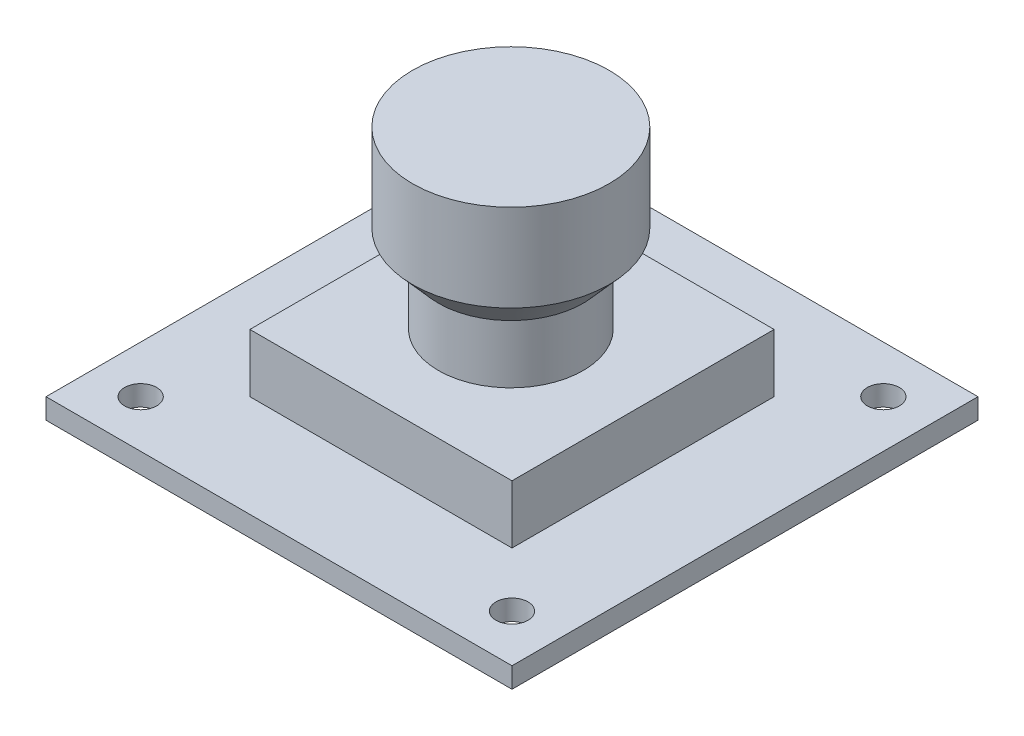
ISO-10303-21;
HEADER;
FILE_DESCRIPTION(('STEP AP214'),'2;1');
FILE_NAME('part.step','',(''),(''),'','','');
FILE_SCHEMA(('AUTOMOTIVE_DESIGN { 1 0 10303 214 1 1 1 1 }'));
ENDSEC;
DATA;
#1=APPLICATION_CONTEXT('core data for automotive mechanical design processes');
#2=APPLICATION_PROTOCOL_DEFINITION('international standard','automotive_design',2000,#1);
#3=PRODUCT_CONTEXT('',#1,'mechanical');
#4=PRODUCT('Part','Part','',(#3));
#5=PRODUCT_RELATED_PRODUCT_CATEGORY('part','',(#4));
#6=PRODUCT_DEFINITION_FORMATION('','',#4);
#7=PRODUCT_DEFINITION_CONTEXT('part definition',#1,'design');
#8=PRODUCT_DEFINITION('design','',#6,#7);
#9=PRODUCT_DEFINITION_SHAPE('','',#8);
#10=(LENGTH_UNIT() NAMED_UNIT(*) SI_UNIT(.MILLI.,.METRE.));
#11=(NAMED_UNIT(*) PLANE_ANGLE_UNIT() SI_UNIT($,.RADIAN.));
#12=(NAMED_UNIT(*) SI_UNIT($,.STERADIAN.) SOLID_ANGLE_UNIT());
#13=UNCERTAINTY_MEASURE_WITH_UNIT(LENGTH_MEASURE(1.E-05),#10,'distance_accuracy_value','');
#14=(GEOMETRIC_REPRESENTATION_CONTEXT(3) GLOBAL_UNCERTAINTY_ASSIGNED_CONTEXT((#13)) GLOBAL_UNIT_ASSIGNED_CONTEXT((#10,
#11,#12)) REPRESENTATION_CONTEXT('',''));
#15=CARTESIAN_POINT('',(0.,0.,0.));
#16=DIRECTION('',(0.,0.,1.));
#17=DIRECTION('',(1.,0.,0.));
#18=AXIS2_PLACEMENT_3D('',#15,#16,#17);
#19=CARTESIAN_POINT('',(0.,1.4,0.));
#20=DIRECTION('',(0.,-1.,0.));
#21=DIRECTION('',(0.,0.,-1.));
#22=AXIS2_PLACEMENT_3D('',#19,#20,#21);
#23=PLANE('',#22);
#24=CARTESIAN_POINT('',(3.25,1.4,-3.25));
#25=DIRECTION('',(0.,1.,0.));
#26=DIRECTION('',(0.,0.,-1.));
#27=AXIS2_PLACEMENT_3D('',#24,#25,#26);
#28=CIRCLE('',#27,1.1);
#29=CARTESIAN_POINT('',(3.25,1.4,-4.35));
#30=VERTEX_POINT('',#29);
#31=EDGE_CURVE('E199',#30,#30,#28,.T.);
#32=ORIENTED_EDGE('',*,*,#31,.F.);
#33=EDGE_LOOP('',(#32));
#34=FACE_BOUND('',#33,.T.);
#35=CARTESIAN_POINT('',(28.75,1.4,-3.25));
#36=DIRECTION('',(0.,1.,0.));
#37=DIRECTION('',(0.,0.,1.));
#38=AXIS2_PLACEMENT_3D('',#35,#36,#37);
#39=CIRCLE('',#38,1.1);
#40=CARTESIAN_POINT('',(28.75,1.4,-2.15));
#41=VERTEX_POINT('',#40);
#42=EDGE_CURVE('E205',#41,#41,#39,.T.);
#43=ORIENTED_EDGE('',*,*,#42,.F.);
#44=EDGE_LOOP('',(#43));
#45=FACE_BOUND('',#44,.T.);
#46=CARTESIAN_POINT('',(28.75,1.4,-28.75));
#47=DIRECTION('',(0.,1.,0.));
#48=DIRECTION('',(0.,0.,-1.));
#49=AXIS2_PLACEMENT_3D('',#46,#47,#48);
#50=CIRCLE('',#49,1.1);
#51=CARTESIAN_POINT('',(28.75,1.4,-29.85));
#52=VERTEX_POINT('',#51);
#53=EDGE_CURVE('E211',#52,#52,#50,.T.);
#54=ORIENTED_EDGE('',*,*,#53,.F.);
#55=EDGE_LOOP('',(#54));
#56=FACE_BOUND('',#55,.T.);
#57=CARTESIAN_POINT('',(3.25,1.4,-28.75));
#58=DIRECTION('',(0.,1.,0.));
#59=DIRECTION('',(0.,0.,1.));
#60=AXIS2_PLACEMENT_3D('',#57,#58,#59);
#61=CIRCLE('',#60,1.1);
#62=CARTESIAN_POINT('',(3.25,1.4,-27.65));
#63=VERTEX_POINT('',#62);
#64=EDGE_CURVE('E217',#63,#63,#61,.T.);
#65=ORIENTED_EDGE('',*,*,#64,.F.);
#66=EDGE_LOOP('',(#65));
#67=FACE_BOUND('',#66,.T.);
#68=DIRECTION('',(0.,0.,1.));
#69=VECTOR('',#68,1.);
#70=CARTESIAN_POINT('',(0.,1.4,0.));
#71=LINE('',#70,#69);
#72=CARTESIAN_POINT('',(0.,1.4,-32.));
#73=VERTEX_POINT('',#72);
#74=CARTESIAN_POINT('',(0.,1.4,0.));
#75=VERTEX_POINT('',#74);
#76=EDGE_CURVE('E223',#73,#75,#71,.T.);
#77=ORIENTED_EDGE('',*,*,#76,.T.);
#78=DIRECTION('',(1.,0.,0.));
#79=VECTOR('',#78,1.);
#80=CARTESIAN_POINT('',(0.,1.4,0.));
#81=LINE('',#80,#79);
#82=CARTESIAN_POINT('',(32.,1.4,0.));
#83=VERTEX_POINT('',#82);
#84=EDGE_CURVE('E226',#75,#83,#81,.T.);
#85=ORIENTED_EDGE('',*,*,#84,.T.);
#86=DIRECTION('',(0.,0.,-1.));
#87=VECTOR('',#86,1.);
#88=CARTESIAN_POINT('',(32.,1.4,0.));
#89=LINE('',#88,#87);
#90=CARTESIAN_POINT('',(32.,1.4,-32.));
#91=VERTEX_POINT('',#90);
#92=EDGE_CURVE('E229',#83,#91,#89,.T.);
#93=ORIENTED_EDGE('',*,*,#92,.T.);
#94=DIRECTION('',(-1.,0.,0.));
#95=VECTOR('',#94,1.);
#96=CARTESIAN_POINT('',(0.,1.4,-32.));
#97=LINE('',#96,#95);
#98=EDGE_CURVE('E231',#91,#73,#97,.T.);
#99=ORIENTED_EDGE('',*,*,#98,.T.);
#100=EDGE_LOOP('',(#77,#85,#93,#99));
#101=FACE_BOUND('',#100,.T.);
#102=DIRECTION('',(0.,0.,-1.));
#103=VECTOR('',#102,1.);
#104=CARTESIAN_POINT('',(25.,1.4,-7.));
#105=LINE('',#104,#103);
#106=CARTESIAN_POINT('',(25.,1.4,-7.));
#107=VERTEX_POINT('',#106);
#108=CARTESIAN_POINT('',(25.,1.4,-25.));
#109=VERTEX_POINT('',#108);
#110=EDGE_CURVE('E165',#107,#109,#105,.T.);
#111=ORIENTED_EDGE('',*,*,#110,.F.);
#112=DIRECTION('',(1.,0.,0.));
#113=VECTOR('',#112,1.);
#114=CARTESIAN_POINT('',(7.,1.4,-7.));
#115=LINE('',#114,#113);
#116=CARTESIAN_POINT('',(7.,1.4,-7.));
#117=VERTEX_POINT('',#116);
#118=EDGE_CURVE('E170',#117,#107,#115,.T.);
#119=ORIENTED_EDGE('',*,*,#118,.F.);
#120=DIRECTION('',(0.,0.,1.));
#121=VECTOR('',#120,1.);
#122=CARTESIAN_POINT('',(7.,1.4,-7.));
#123=LINE('',#122,#121);
#124=CARTESIAN_POINT('',(7.,1.4,-25.));
#125=VERTEX_POINT('',#124);
#126=EDGE_CURVE('E182',#125,#117,#123,.T.);
#127=ORIENTED_EDGE('',*,*,#126,.F.);
#128=DIRECTION('',(-1.,0.,0.));
#129=VECTOR('',#128,1.);
#130=CARTESIAN_POINT('',(7.,1.4,-25.));
#131=LINE('',#130,#129);
#132=EDGE_CURVE('E179',#109,#125,#131,.T.);
#133=ORIENTED_EDGE('',*,*,#132,.F.);
#134=EDGE_LOOP('',(#111,#119,#127,#133));
#135=FACE_BOUND('',#134,.T.);
#136=ADVANCED_FACE('F35',(#34,#45,#56,#67,#101,#135),#23,.F.);
#137=CARTESIAN_POINT('',(0.,0.,0.));
#138=DIRECTION('',(0.,-1.,0.));
#139=DIRECTION('',(0.,0.,-1.));
#140=AXIS2_PLACEMENT_3D('',#137,#138,#139);
#141=PLANE('',#140);
#142=DIRECTION('',(0.,0.,-1.));
#143=VECTOR('',#142,1.);
#144=CARTESIAN_POINT('',(0.249894634770157,0.,-27.65));
#145=LINE('',#144,#143);
#146=CARTESIAN_POINT('',(0.249894634770157,0.,-18.65));
#147=VERTEX_POINT('',#146);
#148=CARTESIAN_POINT('',(0.249894634770157,0.,-27.65));
#149=VERTEX_POINT('',#148);
#150=EDGE_CURVE('E50',#147,#149,#145,.T.);
#151=ORIENTED_EDGE('',*,*,#150,.F.);
#152=DIRECTION('',(-1.,0.,0.));
#153=VECTOR('',#152,1.);
#154=CARTESIAN_POINT('',(0.249894634770157,0.,-18.65));
#155=LINE('',#154,#153);
#156=CARTESIAN_POINT('',(4.24989463477016,0.,-18.65));
#157=VERTEX_POINT('',#156);
#158=EDGE_CURVE('E54',#157,#147,#155,.T.);
#159=ORIENTED_EDGE('',*,*,#158,.F.);
#160=DIRECTION('',(0.,0.,1.));
#161=VECTOR('',#160,1.);
#162=CARTESIAN_POINT('',(4.24989463477016,0.,-27.65));
#163=LINE('',#162,#161);
#164=CARTESIAN_POINT('',(4.24989463477016,0.,-27.65));
#165=VERTEX_POINT('',#164);
#166=EDGE_CURVE('E380',#165,#157,#163,.T.);
#167=ORIENTED_EDGE('',*,*,#166,.F.);
#168=DIRECTION('',(1.,0.,0.));
#169=VECTOR('',#168,1.);
#170=CARTESIAN_POINT('',(0.249894634770157,0.,-27.65));
#171=LINE('',#170,#169);
#172=CARTESIAN_POINT('',(3.25,0.,-27.65));
#173=VERTEX_POINT('',#172);
#174=EDGE_CURVE('E252',#173,#165,#171,.T.);
#175=ORIENTED_EDGE('',*,*,#174,.F.);
#176=CARTESIAN_POINT('',(3.25,0.,-28.75));
#177=DIRECTION('',(0.,1.,0.));
#178=DIRECTION('',(0.,0.,1.));
#179=AXIS2_PLACEMENT_3D('',#176,#177,#178);
#180=CIRCLE('',#179,1.1);
#181=EDGE_CURVE('E214',#173,#173,#180,.T.);
#182=ORIENTED_EDGE('',*,*,#181,.T.);
#183=EDGE_CURVE('E379',#149,#173,#171,.T.);
#184=ORIENTED_EDGE('',*,*,#183,.F.);
#185=EDGE_LOOP('',(#151,#159,#167,#175,#182,#184));
#186=FACE_BOUND('',#185,.T.);
#187=CARTESIAN_POINT('',(28.75,0.,-3.25));
#188=DIRECTION('',(0.,1.,0.));
#189=DIRECTION('',(0.,0.,1.));
#190=AXIS2_PLACEMENT_3D('',#187,#188,#189);
#191=CIRCLE('',#190,1.1);
#192=CARTESIAN_POINT('',(28.75,0.,-2.15));
#193=VERTEX_POINT('',#192);
#194=EDGE_CURVE('E202',#193,#193,#191,.T.);
#195=ORIENTED_EDGE('',*,*,#194,.T.);
#196=EDGE_LOOP('',(#195));
#197=FACE_BOUND('',#196,.T.);
#198=DIRECTION('',(0.,0.,1.));
#199=VECTOR('',#198,1.);
#200=CARTESIAN_POINT('',(0.,0.,0.));
#201=LINE('',#200,#199);
#202=CARTESIAN_POINT('',(0.,0.,-32.));
#203=VERTEX_POINT('',#202);
#204=CARTESIAN_POINT('',(0.,0.,0.));
#205=VERTEX_POINT('',#204);
#206=EDGE_CURVE('E220',#203,#205,#201,.T.);
#207=ORIENTED_EDGE('',*,*,#206,.F.);
#208=DIRECTION('',(-1.,0.,0.));
#209=VECTOR('',#208,1.);
#210=CARTESIAN_POINT('',(0.,0.,-32.));
#211=LINE('',#210,#209);
#212=CARTESIAN_POINT('',(32.,0.,-32.));
#213=VERTEX_POINT('',#212);
#214=EDGE_CURVE('E227',#213,#203,#211,.T.);
#215=ORIENTED_EDGE('',*,*,#214,.F.);
#216=DIRECTION('',(0.,0.,-1.));
#217=VECTOR('',#216,1.);
#218=CARTESIAN_POINT('',(32.,0.,0.));
#219=LINE('',#218,#217);
#220=CARTESIAN_POINT('',(32.,0.,0.));
#221=VERTEX_POINT('',#220);
#222=EDGE_CURVE('E238',#221,#213,#219,.T.);
#223=ORIENTED_EDGE('',*,*,#222,.F.);
#224=DIRECTION('',(1.,0.,0.));
#225=VECTOR('',#224,1.);
#226=CARTESIAN_POINT('',(0.,0.,0.));
#227=LINE('',#226,#225);
#228=EDGE_CURVE('E236',#205,#221,#227,.T.);
#229=ORIENTED_EDGE('',*,*,#228,.F.);
#230=EDGE_LOOP('',(#207,#215,#223,#229));
#231=FACE_BOUND('',#230,.T.);
#232=CARTESIAN_POINT('',(28.75,0.,-28.75));
#233=DIRECTION('',(0.,1.,0.));
#234=DIRECTION('',(0.,0.,-1.));
#235=AXIS2_PLACEMENT_3D('',#232,#233,#234);
#236=CIRCLE('',#235,1.1);
#237=CARTESIAN_POINT('',(28.75,0.,-29.85));
#238=VERTEX_POINT('',#237);
#239=EDGE_CURVE('E208',#238,#238,#236,.T.);
#240=ORIENTED_EDGE('',*,*,#239,.T.);
#241=EDGE_LOOP('',(#240));
#242=FACE_BOUND('',#241,.T.);
#243=CARTESIAN_POINT('',(3.25,0.,-3.25));
#244=DIRECTION('',(0.,1.,0.));
#245=DIRECTION('',(0.,0.,-1.));
#246=AXIS2_PLACEMENT_3D('',#243,#244,#245);
#247=CIRCLE('',#246,1.1);
#248=CARTESIAN_POINT('',(3.25,0.,-4.35));
#249=VERTEX_POINT('',#248);
#250=EDGE_CURVE('E198',#249,#249,#247,.T.);
#251=ORIENTED_EDGE('',*,*,#250,.T.);
#252=EDGE_LOOP('',(#251));
#253=FACE_BOUND('',#252,.T.);
#254=ADVANCED_FACE('F285',(#186,#197,#231,#242,#253),#141,.T.);
#255=CARTESIAN_POINT('',(0.,1.4,0.));
#256=DIRECTION('',(1.,0.,0.));
#257=DIRECTION('',(0.,0.,-1.));
#258=AXIS2_PLACEMENT_3D('',#255,#256,#257);
#259=PLANE('',#258);
#260=ORIENTED_EDGE('',*,*,#206,.T.);
#261=DIRECTION('',(0.,-1.,0.));
#262=VECTOR('',#261,1.);
#263=CARTESIAN_POINT('',(0.,1.4,0.));
#264=LINE('',#263,#262);
#265=EDGE_CURVE('E249',#75,#205,#264,.T.);
#266=ORIENTED_EDGE('',*,*,#265,.F.);
#267=ORIENTED_EDGE('',*,*,#76,.F.);
#268=DIRECTION('',(0.,-1.,0.));
#269=VECTOR('',#268,1.);
#270=CARTESIAN_POINT('',(0.,1.4,-32.));
#271=LINE('',#270,#269);
#272=EDGE_CURVE('E233',#73,#203,#271,.T.);
#273=ORIENTED_EDGE('',*,*,#272,.T.);
#274=EDGE_LOOP('',(#260,#266,#267,#273));
#275=FACE_BOUND('',#274,.T.);
#276=ADVANCED_FACE('F37',(#275),#259,.F.);
#277=CARTESIAN_POINT('',(0.,1.4,0.));
#278=DIRECTION('',(0.,0.,-1.));
#279=DIRECTION('',(-1.,0.,0.));
#280=AXIS2_PLACEMENT_3D('',#277,#278,#279);
#281=PLANE('',#280);
#282=ORIENTED_EDGE('',*,*,#228,.T.);
#283=DIRECTION('',(0.,-1.,0.));
#284=VECTOR('',#283,1.);
#285=CARTESIAN_POINT('',(32.,1.4,0.));
#286=LINE('',#285,#284);
#287=EDGE_CURVE('E246',#83,#221,#286,.T.);
#288=ORIENTED_EDGE('',*,*,#287,.F.);
#289=ORIENTED_EDGE('',*,*,#84,.F.);
#290=ORIENTED_EDGE('',*,*,#265,.T.);
#291=EDGE_LOOP('',(#282,#288,#289,#290));
#292=FACE_BOUND('',#291,.T.);
#293=ADVANCED_FACE('F304',(#292),#281,.F.);
#294=CARTESIAN_POINT('',(32.,1.4,0.));
#295=DIRECTION('',(-1.,0.,0.));
#296=DIRECTION('',(0.,0.,1.));
#297=AXIS2_PLACEMENT_3D('',#294,#295,#296);
#298=PLANE('',#297);
#299=ORIENTED_EDGE('',*,*,#222,.T.);
#300=DIRECTION('',(0.,-1.,0.));
#301=VECTOR('',#300,1.);
#302=CARTESIAN_POINT('',(32.,1.4,-32.));
#303=LINE('',#302,#301);
#304=EDGE_CURVE('E243',#91,#213,#303,.T.);
#305=ORIENTED_EDGE('',*,*,#304,.F.);
#306=ORIENTED_EDGE('',*,*,#92,.F.);
#307=ORIENTED_EDGE('',*,*,#287,.T.);
#308=EDGE_LOOP('',(#299,#305,#306,#307));
#309=FACE_BOUND('',#308,.T.);
#310=ADVANCED_FACE('F301',(#309),#298,.F.);
#311=CARTESIAN_POINT('',(0.,1.4,-32.));
#312=DIRECTION('',(0.,0.,1.));
#313=DIRECTION('',(1.,0.,0.));
#314=AXIS2_PLACEMENT_3D('',#311,#312,#313);
#315=PLANE('',#314);
#316=ORIENTED_EDGE('',*,*,#214,.T.);
#317=ORIENTED_EDGE('',*,*,#272,.F.);
#318=ORIENTED_EDGE('',*,*,#98,.F.);
#319=ORIENTED_EDGE('',*,*,#304,.T.);
#320=EDGE_LOOP('',(#316,#317,#318,#319));
#321=FACE_BOUND('',#320,.T.);
#322=ADVANCED_FACE('F298',(#321),#315,.F.);
#323=CARTESIAN_POINT('',(3.25,1.4,-28.75));
#324=DIRECTION('',(0.,-1.,0.));
#325=DIRECTION('',(0.,0.,-1.));
#326=AXIS2_PLACEMENT_3D('',#323,#324,#325);
#327=CYLINDRICAL_SURFACE('',#326,1.1);
#328=ORIENTED_EDGE('',*,*,#64,.T.);
#329=EDGE_LOOP('',(#328));
#330=FACE_BOUND('',#329,.T.);
#331=ORIENTED_EDGE('',*,*,#181,.F.);
#332=EDGE_LOOP('',(#331));
#333=FACE_BOUND('',#332,.T.);
#334=ADVANCED_FACE('F295',(#330,#333),#327,.F.);
#335=CARTESIAN_POINT('',(28.75,1.4,-28.75));
#336=DIRECTION('',(0.,-1.,0.));
#337=DIRECTION('',(0.,0.,-1.));
#338=AXIS2_PLACEMENT_3D('',#335,#336,#337);
#339=CYLINDRICAL_SURFACE('',#338,1.1);
#340=ORIENTED_EDGE('',*,*,#53,.T.);
#341=EDGE_LOOP('',(#340));
#342=FACE_BOUND('',#341,.T.);
#343=ORIENTED_EDGE('',*,*,#239,.F.);
#344=EDGE_LOOP('',(#343));
#345=FACE_BOUND('',#344,.T.);
#346=ADVANCED_FACE('F360',(#342,#345),#339,.F.);
#347=CARTESIAN_POINT('',(28.75,1.4,-3.25));
#348=DIRECTION('',(0.,-1.,0.));
#349=DIRECTION('',(0.,0.,-1.));
#350=AXIS2_PLACEMENT_3D('',#347,#348,#349);
#351=CYLINDRICAL_SURFACE('',#350,1.1);
#352=ORIENTED_EDGE('',*,*,#42,.T.);
#353=EDGE_LOOP('',(#352));
#354=FACE_BOUND('',#353,.T.);
#355=ORIENTED_EDGE('',*,*,#194,.F.);
#356=EDGE_LOOP('',(#355));
#357=FACE_BOUND('',#356,.T.);
#358=ADVANCED_FACE('F357',(#354,#357),#351,.F.);
#359=CARTESIAN_POINT('',(3.25,1.4,-3.25));
#360=DIRECTION('',(0.,-1.,0.));
#361=DIRECTION('',(0.,0.,-1.));
#362=AXIS2_PLACEMENT_3D('',#359,#360,#361);
#363=CYLINDRICAL_SURFACE('',#362,1.1);
#364=ORIENTED_EDGE('',*,*,#31,.T.);
#365=EDGE_LOOP('',(#364));
#366=FACE_BOUND('',#365,.T.);
#367=ORIENTED_EDGE('',*,*,#250,.F.);
#368=EDGE_LOOP('',(#367));
#369=FACE_BOUND('',#368,.T.);
#370=ADVANCED_FACE('F351',(#366,#369),#363,.F.);
#371=CARTESIAN_POINT('',(25.,5.4,-7.));
#372=DIRECTION('',(-1.,0.,0.));
#373=DIRECTION('',(0.,0.,1.));
#374=AXIS2_PLACEMENT_3D('',#371,#372,#373);
#375=PLANE('',#374);
#376=ORIENTED_EDGE('',*,*,#110,.T.);
#377=DIRECTION('',(0.,-1.,0.));
#378=VECTOR('',#377,1.);
#379=CARTESIAN_POINT('',(25.,5.4,-25.));
#380=LINE('',#379,#378);
#381=CARTESIAN_POINT('',(25.,5.4,-25.));
#382=VERTEX_POINT('',#381);
#383=EDGE_CURVE('E195',#382,#109,#380,.T.);
#384=ORIENTED_EDGE('',*,*,#383,.F.);
#385=DIRECTION('',(0.,0.,-1.));
#386=VECTOR('',#385,1.);
#387=CARTESIAN_POINT('',(25.,5.4,-7.));
#388=LINE('',#387,#386);
#389=CARTESIAN_POINT('',(25.,5.4,-7.));
#390=VERTEX_POINT('',#389);
#391=EDGE_CURVE('E166',#390,#382,#388,.T.);
#392=ORIENTED_EDGE('',*,*,#391,.F.);
#393=DIRECTION('',(0.,-1.,0.));
#394=VECTOR('',#393,1.);
#395=CARTESIAN_POINT('',(25.,5.4,-7.));
#396=LINE('',#395,#394);
#397=EDGE_CURVE('E176',#390,#107,#396,.T.);
#398=ORIENTED_EDGE('',*,*,#397,.T.);
#399=EDGE_LOOP('',(#376,#384,#392,#398));
#400=FACE_BOUND('',#399,.T.);
#401=ADVANCED_FACE('F334',(#400),#375,.F.);
#402=CARTESIAN_POINT('',(7.,5.4,-25.));
#403=DIRECTION('',(0.,0.,1.));
#404=DIRECTION('',(1.,0.,0.));
#405=AXIS2_PLACEMENT_3D('',#402,#403,#404);
#406=PLANE('',#405);
#407=ORIENTED_EDGE('',*,*,#132,.T.);
#408=DIRECTION('',(0.,-1.,0.));
#409=VECTOR('',#408,1.);
#410=CARTESIAN_POINT('',(7.,5.4,-25.));
#411=LINE('',#410,#409);
#412=CARTESIAN_POINT('',(7.,5.4,-25.));
#413=VERTEX_POINT('',#412);
#414=EDGE_CURVE('E192',#413,#125,#411,.T.);
#415=ORIENTED_EDGE('',*,*,#414,.F.);
#416=DIRECTION('',(-1.,0.,0.));
#417=VECTOR('',#416,1.);
#418=CARTESIAN_POINT('',(7.,5.4,-25.));
#419=LINE('',#418,#417);
#420=EDGE_CURVE('E169',#382,#413,#419,.T.);
#421=ORIENTED_EDGE('',*,*,#420,.F.);
#422=ORIENTED_EDGE('',*,*,#383,.T.);
#423=EDGE_LOOP('',(#407,#415,#421,#422));
#424=FACE_BOUND('',#423,.T.);
#425=ADVANCED_FACE('F343',(#424),#406,.F.);
#426=CARTESIAN_POINT('',(7.,5.4,-7.));
#427=DIRECTION('',(1.,0.,0.));
#428=DIRECTION('',(0.,0.,-1.));
#429=AXIS2_PLACEMENT_3D('',#426,#427,#428);
#430=PLANE('',#429);
#431=ORIENTED_EDGE('',*,*,#126,.T.);
#432=DIRECTION('',(0.,-1.,0.));
#433=VECTOR('',#432,1.);
#434=CARTESIAN_POINT('',(7.,5.4,-7.));
#435=LINE('',#434,#433);
#436=CARTESIAN_POINT('',(7.,5.4,-7.));
#437=VERTEX_POINT('',#436);
#438=EDGE_CURVE('E189',#437,#117,#435,.T.);
#439=ORIENTED_EDGE('',*,*,#438,.F.);
#440=DIRECTION('',(0.,0.,1.));
#441=VECTOR('',#440,1.);
#442=CARTESIAN_POINT('',(7.,5.4,-7.));
#443=LINE('',#442,#441);
#444=EDGE_CURVE('E172',#413,#437,#443,.T.);
#445=ORIENTED_EDGE('',*,*,#444,.F.);
#446=ORIENTED_EDGE('',*,*,#414,.T.);
#447=EDGE_LOOP('',(#431,#439,#445,#446));
#448=FACE_BOUND('',#447,.T.);
#449=ADVANCED_FACE('F341',(#448),#430,.F.);
#450=CARTESIAN_POINT('',(7.,5.4,-7.));
#451=DIRECTION('',(0.,0.,-1.));
#452=DIRECTION('',(-1.,0.,0.));
#453=AXIS2_PLACEMENT_3D('',#450,#451,#452);
#454=PLANE('',#453);
#455=ORIENTED_EDGE('',*,*,#118,.T.);
#456=ORIENTED_EDGE('',*,*,#397,.F.);
#457=DIRECTION('',(1.,0.,0.));
#458=VECTOR('',#457,1.);
#459=CARTESIAN_POINT('',(7.,5.4,-7.));
#460=LINE('',#459,#458);
#461=EDGE_CURVE('E174',#437,#390,#460,.T.);
#462=ORIENTED_EDGE('',*,*,#461,.F.);
#463=ORIENTED_EDGE('',*,*,#438,.T.);
#464=EDGE_LOOP('',(#455,#456,#462,#463));
#465=FACE_BOUND('',#464,.T.);
#466=ADVANCED_FACE('F330',(#465),#454,.F.);
#467=CARTESIAN_POINT('',(0.,5.4,0.));
#468=DIRECTION('',(0.,-1.,0.));
#469=DIRECTION('',(0.,0.,-1.));
#470=AXIS2_PLACEMENT_3D('',#467,#468,#469);
#471=PLANE('',#470);
#472=ORIENTED_EDGE('',*,*,#391,.T.);
#473=ORIENTED_EDGE('',*,*,#420,.T.);
#474=ORIENTED_EDGE('',*,*,#444,.T.);
#475=ORIENTED_EDGE('',*,*,#461,.T.);
#476=EDGE_LOOP('',(#472,#473,#474,#475));
#477=FACE_BOUND('',#476,.T.);
#478=CARTESIAN_POINT('',(15.9200113524972,5.4,-16.));
#479=DIRECTION('',(0.,1.,0.));
#480=DIRECTION('',(0.,0.,1.));
#481=AXIS2_PLACEMENT_3D('',#478,#479,#480);
#482=CIRCLE('',#481,4.97248448438804);
#483=CARTESIAN_POINT('',(15.9200113524972,5.4,-11.027515515612));
#484=VERTEX_POINT('',#483);
#485=EDGE_CURVE('E159',#484,#484,#482,.T.);
#486=ORIENTED_EDGE('',*,*,#485,.F.);
#487=EDGE_LOOP('',(#486));
#488=FACE_BOUND('',#487,.T.);
#489=ADVANCED_FACE('F336',(#477,#488),#471,.F.);
#490=CARTESIAN_POINT('',(15.9200113524972,17.4,-16.));
#491=DIRECTION('',(0.,1.,0.));
#492=DIRECTION('',(0.,0.,1.));
#493=AXIS2_PLACEMENT_3D('',#490,#491,#492);
#494=CYLINDRICAL_SURFACE('',#493,4.97248448438804);
#495=CARTESIAN_POINT('',(15.9200113524972,9.4,-16.));
#496=DIRECTION('',(0.,1.,0.));
#497=DIRECTION('',(0.,0.,1.));
#498=AXIS2_PLACEMENT_3D('',#495,#496,#497);
#499=CIRCLE('',#498,4.97248448438804);
#500=CARTESIAN_POINT('',(15.9200113524972,9.4,-11.027515515612));
#501=VERTEX_POINT('',#500);
#502=EDGE_CURVE('E151',#501,#501,#499,.T.);
#503=ORIENTED_EDGE('',*,*,#502,.F.);
#504=EDGE_LOOP('',(#503));
#505=FACE_BOUND('',#504,.T.);
#506=ORIENTED_EDGE('',*,*,#485,.T.);
#507=EDGE_LOOP('',(#506));
#508=FACE_BOUND('',#507,.T.);
#509=ADVANCED_FACE('F525',(#505,#508),#494,.T.);
#510=CARTESIAN_POINT('',(15.9200113524972,9.4,-16.));
#511=DIRECTION('',(0.,1.,0.));
#512=DIRECTION('',(0.,0.,1.));
#513=AXIS2_PLACEMENT_3D('',#510,#511,#512);
#514=CONICAL_SURFACE('',#513,4.97248448438804,0.726569083375857);
#515=CARTESIAN_POINT('',(15.9200113524972,11.4,-16.));
#516=DIRECTION('',(0.,1.,0.));
#517=DIRECTION('',(0.,0.,1.));
#518=AXIS2_PLACEMENT_3D('',#515,#516,#517);
#519=CIRCLE('',#518,6.75);
#520=CARTESIAN_POINT('',(15.9200113524972,11.4,-9.25));
#521=VERTEX_POINT('',#520);
#522=EDGE_CURVE('E148',#521,#521,#519,.T.);
#523=ORIENTED_EDGE('',*,*,#522,.F.);
#524=EDGE_LOOP('',(#523));
#525=FACE_BOUND('',#524,.T.);
#526=ORIENTED_EDGE('',*,*,#502,.T.);
#527=EDGE_LOOP('',(#526));
#528=FACE_BOUND('',#527,.T.);
#529=ADVANCED_FACE('F518',(#525,#528),#514,.T.);
#530=CARTESIAN_POINT('',(15.9200113524972,17.4,-16.));
#531=DIRECTION('',(0.,1.,0.));
#532=DIRECTION('',(0.,0.,1.));
#533=AXIS2_PLACEMENT_3D('',#530,#531,#532);
#534=PLANE('',#533);
#535=CARTESIAN_POINT('',(15.9200113524972,17.4,-16.));
#536=DIRECTION('',(0.,1.,0.));
#537=DIRECTION('',(0.,0.,1.));
#538=AXIS2_PLACEMENT_3D('',#535,#536,#537);
#539=CIRCLE('',#538,6.75);
#540=CARTESIAN_POINT('',(15.9200113524972,17.4,-9.25));
#541=VERTEX_POINT('',#540);
#542=EDGE_CURVE('E162',#541,#541,#539,.T.);
#543=ORIENTED_EDGE('',*,*,#542,.T.);
#544=EDGE_LOOP('',(#543));
#545=FACE_BOUND('',#544,.T.);
#546=ADVANCED_FACE('F524',(#545),#534,.T.);
#547=CARTESIAN_POINT('',(15.9200113524972,17.4,-16.));
#548=DIRECTION('',(0.,-1.,0.));
#549=DIRECTION('',(0.,0.,-1.));
#550=AXIS2_PLACEMENT_3D('',#547,#548,#549);
#551=CYLINDRICAL_SURFACE('',#550,6.75);
#552=ORIENTED_EDGE('',*,*,#522,.T.);
#553=EDGE_LOOP('',(#552));
#554=FACE_BOUND('',#553,.T.);
#555=ORIENTED_EDGE('',*,*,#542,.F.);
#556=EDGE_LOOP('',(#555));
#557=FACE_BOUND('',#556,.T.);
#558=ADVANCED_FACE('F514',(#554,#557),#551,.T.);
#559=CARTESIAN_POINT('',(0.249894634770157,-8.,-27.65));
#560=DIRECTION('',(1.,0.,0.));
#561=DIRECTION('',(0.,0.,-1.));
#562=AXIS2_PLACEMENT_3D('',#559,#560,#561);
#563=PLANE('',#562);
#564=ORIENTED_EDGE('',*,*,#150,.T.);
#565=DIRECTION('',(0.,1.,0.));
#566=VECTOR('',#565,1.);
#567=CARTESIAN_POINT('',(0.249894634770157,-8.,-27.65));
#568=LINE('',#567,#566);
#569=CARTESIAN_POINT('',(0.249894634770157,-8.,-27.65));
#570=VERTEX_POINT('',#569);
#571=EDGE_CURVE('E130',#570,#149,#568,.T.);
#572=ORIENTED_EDGE('',*,*,#571,.F.);
#573=DIRECTION('',(0.,0.,-1.));
#574=VECTOR('',#573,1.);
#575=CARTESIAN_POINT('',(0.249894634770157,-8.,-27.65));
#576=LINE('',#575,#574);
#577=CARTESIAN_POINT('',(0.249894634770157,-8.,-18.65));
#578=VERTEX_POINT('',#577);
#579=EDGE_CURVE('E137',#578,#570,#576,.T.);
#580=ORIENTED_EDGE('',*,*,#579,.F.);
#581=DIRECTION('',(0.,1.,0.));
#582=VECTOR('',#581,1.);
#583=CARTESIAN_POINT('',(0.249894634770157,-8.,-18.65));
#584=LINE('',#583,#582);
#585=EDGE_CURVE('E388',#578,#147,#584,.T.);
#586=ORIENTED_EDGE('',*,*,#585,.T.);
#587=EDGE_LOOP('',(#564,#572,#580,#586));
#588=FACE_BOUND('',#587,.T.);
#589=ADVANCED_FACE('F147',(#588),#563,.F.);
#590=CARTESIAN_POINT('',(0.249894634770157,-8.,-27.65));
#591=DIRECTION('',(0.,0.,1.));
#592=DIRECTION('',(1.,0.,0.));
#593=AXIS2_PLACEMENT_3D('',#590,#591,#592);
#594=PLANE('',#593);
#595=ORIENTED_EDGE('',*,*,#183,.T.);
#596=ORIENTED_EDGE('',*,*,#174,.T.);
#597=DIRECTION('',(0.,1.,0.));
#598=VECTOR('',#597,1.);
#599=CARTESIAN_POINT('',(4.24989463477016,-8.,-27.65));
#600=LINE('',#599,#598);
#601=CARTESIAN_POINT('',(4.24989463477016,-8.,-27.65));
#602=VERTEX_POINT('',#601);
#603=EDGE_CURVE('E133',#602,#165,#600,.T.);
#604=ORIENTED_EDGE('',*,*,#603,.F.);
#605=DIRECTION('',(1.,0.,0.));
#606=VECTOR('',#605,1.);
#607=CARTESIAN_POINT('',(0.249894634770157,-8.,-27.65));
#608=LINE('',#607,#606);
#609=EDGE_CURVE('E125',#570,#602,#608,.T.);
#610=ORIENTED_EDGE('',*,*,#609,.F.);
#611=ORIENTED_EDGE('',*,*,#571,.T.);
#612=EDGE_LOOP('',(#595,#596,#604,#610,#611));
#613=FACE_BOUND('',#612,.T.);
#614=ADVANCED_FACE('F128',(#613),#594,.F.);
#615=CARTESIAN_POINT('',(4.24989463477016,-8.,-27.65));
#616=DIRECTION('',(-1.,0.,0.));
#617=DIRECTION('',(0.,0.,1.));
#618=AXIS2_PLACEMENT_3D('',#615,#616,#617);
#619=PLANE('',#618);
#620=ORIENTED_EDGE('',*,*,#166,.T.);
#621=DIRECTION('',(0.,1.,0.));
#622=VECTOR('',#621,1.);
#623=CARTESIAN_POINT('',(4.24989463477016,-8.,-18.65));
#624=LINE('',#623,#622);
#625=CARTESIAN_POINT('',(4.24989463477016,-8.,-18.65));
#626=VERTEX_POINT('',#625);
#627=EDGE_CURVE('E153',#626,#157,#624,.T.);
#628=ORIENTED_EDGE('',*,*,#627,.F.);
#629=DIRECTION('',(0.,0.,1.));
#630=VECTOR('',#629,1.);
#631=CARTESIAN_POINT('',(4.24989463477016,-8.,-27.65));
#632=LINE('',#631,#630);
#633=EDGE_CURVE('E136',#602,#626,#632,.T.);
#634=ORIENTED_EDGE('',*,*,#633,.F.);
#635=ORIENTED_EDGE('',*,*,#603,.T.);
#636=EDGE_LOOP('',(#620,#628,#634,#635));
#637=FACE_BOUND('',#636,.T.);
#638=ADVANCED_FACE('F393',(#637),#619,.F.);
#639=CARTESIAN_POINT('',(0.249894634770157,-8.,-18.65));
#640=DIRECTION('',(0.,0.,-1.));
#641=DIRECTION('',(-1.,0.,0.));
#642=AXIS2_PLACEMENT_3D('',#639,#640,#641);
#643=PLANE('',#642);
#644=ORIENTED_EDGE('',*,*,#158,.T.);
#645=ORIENTED_EDGE('',*,*,#585,.F.);
#646=DIRECTION('',(-1.,0.,0.));
#647=VECTOR('',#646,1.);
#648=CARTESIAN_POINT('',(0.249894634770157,-8.,-18.65));
#649=LINE('',#648,#647);
#650=EDGE_CURVE('E142',#626,#578,#649,.T.);
#651=ORIENTED_EDGE('',*,*,#650,.F.);
#652=ORIENTED_EDGE('',*,*,#627,.T.);
#653=EDGE_LOOP('',(#644,#645,#651,#652));
#654=FACE_BOUND('',#653,.T.);
#655=ADVANCED_FACE('F266',(#654),#643,.F.);
#656=CARTESIAN_POINT('',(0.,-8.,0.));
#657=DIRECTION('',(0.,1.,0.));
#658=DIRECTION('',(0.,0.,1.));
#659=AXIS2_PLACEMENT_3D('',#656,#657,#658);
#660=PLANE('',#659);
#661=CARTESIAN_POINT('',(1.95054541342222,-8.,-26.5137218405359));
#662=DIRECTION('',(0.,1.,0.));
#663=DIRECTION('',(0.,0.,1.));
#664=AXIS2_PLACEMENT_3D('',#661,#662,#663);
#665=CIRCLE('',#664,0.531026098886591);
#666=CARTESIAN_POINT('',(1.95054541342222,-8.,-25.9826957416493));
#667=VERTEX_POINT('',#666);
#668=EDGE_CURVE('E11',#667,#667,#665,.F.);
#669=ORIENTED_EDGE('',*,*,#668,.F.);
#670=EDGE_LOOP('',(#669));
#671=FACE_BOUND('',#670,.T.);
#672=CARTESIAN_POINT('',(1.9505454134222,-8.,-24.5137218405359));
#673=DIRECTION('',(0.,1.,0.));
#674=DIRECTION('',(0.,0.,1.));
#675=AXIS2_PLACEMENT_3D('',#672,#673,#674);
#676=CIRCLE('',#675,0.53102609888659);
#677=CARTESIAN_POINT('',(1.9505454134222,-8.,-23.9826957416493));
#678=VERTEX_POINT('',#677);
#679=EDGE_CURVE('E43',#678,#678,#676,.F.);
#680=ORIENTED_EDGE('',*,*,#679,.F.);
#681=EDGE_LOOP('',(#680));
#682=FACE_BOUND('',#681,.T.);
#683=CARTESIAN_POINT('',(1.95054541342218,-8.,-22.5137218405359));
#684=DIRECTION('',(0.,1.,0.));
#685=DIRECTION('',(0.,0.,1.));
#686=AXIS2_PLACEMENT_3D('',#683,#684,#685);
#687=CIRCLE('',#686,0.531026098886589);
#688=CARTESIAN_POINT('',(1.95054541342218,-8.,-21.9826957416493));
#689=VERTEX_POINT('',#688);
#690=EDGE_CURVE('E256',#689,#689,#687,.F.);
#691=ORIENTED_EDGE('',*,*,#690,.F.);
#692=EDGE_LOOP('',(#691));
#693=FACE_BOUND('',#692,.T.);
#694=CARTESIAN_POINT('',(1.95054541342216,-8.,-20.5137218405359));
#695=DIRECTION('',(0.,1.,0.));
#696=DIRECTION('',(0.,0.,1.));
#697=AXIS2_PLACEMENT_3D('',#694,#695,#696);
#698=CIRCLE('',#697,0.53102609888659);
#699=CARTESIAN_POINT('',(1.95054541342216,-8.,-19.9826957416493));
#700=VERTEX_POINT('',#699);
#701=EDGE_CURVE('E253',#700,#700,#698,.F.);
#702=ORIENTED_EDGE('',*,*,#701,.F.);
#703=EDGE_LOOP('',(#702));
#704=FACE_BOUND('',#703,.T.);
#705=ORIENTED_EDGE('',*,*,#579,.T.);
#706=ORIENTED_EDGE('',*,*,#609,.T.);
#707=ORIENTED_EDGE('',*,*,#633,.T.);
#708=ORIENTED_EDGE('',*,*,#650,.T.);
#709=EDGE_LOOP('',(#705,#706,#707,#708));
#710=FACE_BOUND('',#709,.T.);
#711=ADVANCED_FACE('F140',(#671,#682,#693,#704,#710),#660,.F.);
#712=CARTESIAN_POINT('',(1.95054541342216,-12.,-20.5137218405359));
#713=DIRECTION('',(0.,1.,0.));
#714=DIRECTION('',(0.,0.,1.));
#715=AXIS2_PLACEMENT_3D('',#712,#713,#714);
#716=CYLINDRICAL_SURFACE('',#715,0.53102609888659);
#717=CARTESIAN_POINT('',(1.95054541342216,-12.,-20.5137218405359));
#718=DIRECTION('',(0.,-1.,0.));
#719=DIRECTION('',(0.,0.,-1.));
#720=AXIS2_PLACEMENT_3D('',#717,#718,#719);
#721=CIRCLE('',#720,0.53102609888659);
#722=CARTESIAN_POINT('',(1.95054541342216,-12.,-21.0447479394225));
#723=VERTEX_POINT('',#722);
#724=EDGE_CURVE('E383',#723,#723,#721,.T.);
#725=ORIENTED_EDGE('',*,*,#724,.F.);
#726=EDGE_LOOP('',(#725));
#727=FACE_BOUND('',#726,.T.);
#728=ORIENTED_EDGE('',*,*,#701,.T.);
#729=EDGE_LOOP('',(#728));
#730=FACE_BOUND('',#729,.T.);
#731=ADVANCED_FACE('F265',(#727,#730),#716,.T.);
#732=CARTESIAN_POINT('',(1.95054541342216,-12.,-20.5137218405359));
#733=DIRECTION('',(0.,-1.,0.));
#734=DIRECTION('',(0.,0.,-1.));
#735=AXIS2_PLACEMENT_3D('',#732,#733,#734);
#736=PLANE('',#735);
#737=ORIENTED_EDGE('',*,*,#724,.T.);
#738=EDGE_LOOP('',(#737));
#739=FACE_BOUND('',#738,.T.);
#740=ADVANCED_FACE('F274',(#739),#736,.T.);
#741=CARTESIAN_POINT('',(1.95054541342218,-12.,-22.5137218405359));
#742=DIRECTION('',(0.,1.,0.));
#743=DIRECTION('',(0.,0.,1.));
#744=AXIS2_PLACEMENT_3D('',#741,#742,#743);
#745=CYLINDRICAL_SURFACE('',#744,0.531026098886589);
#746=CARTESIAN_POINT('',(1.95054541342218,-12.,-22.5137218405359));
#747=DIRECTION('',(0.,-1.,0.));
#748=DIRECTION('',(0.,0.,-1.));
#749=AXIS2_PLACEMENT_3D('',#746,#747,#748);
#750=CIRCLE('',#749,0.531026098886589);
#751=CARTESIAN_POINT('',(1.95054541342218,-12.,-23.0447479394225));
#752=VERTEX_POINT('',#751);
#753=EDGE_CURVE('E401',#752,#752,#750,.T.);
#754=ORIENTED_EDGE('',*,*,#753,.F.);
#755=EDGE_LOOP('',(#754));
#756=FACE_BOUND('',#755,.T.);
#757=ORIENTED_EDGE('',*,*,#690,.T.);
#758=EDGE_LOOP('',(#757));
#759=FACE_BOUND('',#758,.T.);
#760=ADVANCED_FACE('F280',(#756,#759),#745,.T.);
#761=CARTESIAN_POINT('',(1.95054541342218,-12.,-22.5137218405359));
#762=DIRECTION('',(0.,-1.,0.));
#763=DIRECTION('',(0.,0.,-1.));
#764=AXIS2_PLACEMENT_3D('',#761,#762,#763);
#765=PLANE('',#764);
#766=ORIENTED_EDGE('',*,*,#753,.T.);
#767=EDGE_LOOP('',(#766));
#768=FACE_BOUND('',#767,.T.);
#769=ADVANCED_FACE('F429',(#768),#765,.T.);
#770=CARTESIAN_POINT('',(1.9505454134222,-12.,-24.5137218405359));
#771=DIRECTION('',(0.,1.,0.));
#772=DIRECTION('',(0.,0.,1.));
#773=AXIS2_PLACEMENT_3D('',#770,#771,#772);
#774=CYLINDRICAL_SURFACE('',#773,0.53102609888659);
#775=CARTESIAN_POINT('',(1.9505454134222,-12.,-24.5137218405359));
#776=DIRECTION('',(0.,-1.,0.));
#777=DIRECTION('',(0.,0.,-1.));
#778=AXIS2_PLACEMENT_3D('',#775,#776,#777);
#779=CIRCLE('',#778,0.53102609888659);
#780=CARTESIAN_POINT('',(1.9505454134222,-12.,-25.0447479394225));
#781=VERTEX_POINT('',#780);
#782=EDGE_CURVE('E404',#781,#781,#779,.T.);
#783=ORIENTED_EDGE('',*,*,#782,.F.);
#784=EDGE_LOOP('',(#783));
#785=FACE_BOUND('',#784,.T.);
#786=ORIENTED_EDGE('',*,*,#679,.T.);
#787=EDGE_LOOP('',(#786));
#788=FACE_BOUND('',#787,.T.);
#789=ADVANCED_FACE('F261',(#785,#788),#774,.T.);
#790=CARTESIAN_POINT('',(1.9505454134222,-12.,-24.5137218405359));
#791=DIRECTION('',(0.,-1.,0.));
#792=DIRECTION('',(0.,0.,-1.));
#793=AXIS2_PLACEMENT_3D('',#790,#791,#792);
#794=PLANE('',#793);
#795=ORIENTED_EDGE('',*,*,#782,.T.);
#796=EDGE_LOOP('',(#795));
#797=FACE_BOUND('',#796,.T.);
#798=ADVANCED_FACE('F416',(#797),#794,.T.);
#799=CARTESIAN_POINT('',(1.95054541342222,-12.,-26.5137218405359));
#800=DIRECTION('',(0.,1.,0.));
#801=DIRECTION('',(0.,0.,1.));
#802=AXIS2_PLACEMENT_3D('',#799,#800,#801);
#803=CYLINDRICAL_SURFACE('',#802,0.531026098886591);
#804=CARTESIAN_POINT('',(1.95054541342222,-12.,-26.5137218405359));
#805=DIRECTION('',(0.,-1.,0.));
#806=DIRECTION('',(0.,0.,-1.));
#807=AXIS2_PLACEMENT_3D('',#804,#805,#806);
#808=CIRCLE('',#807,0.531026098886591);
#809=CARTESIAN_POINT('',(1.95054541342222,-12.,-27.0447479394225));
#810=VERTEX_POINT('',#809);
#811=EDGE_CURVE('E407',#810,#810,#808,.T.);
#812=ORIENTED_EDGE('',*,*,#811,.F.);
#813=EDGE_LOOP('',(#812));
#814=FACE_BOUND('',#813,.T.);
#815=ORIENTED_EDGE('',*,*,#668,.T.);
#816=EDGE_LOOP('',(#815));
#817=FACE_BOUND('',#816,.T.);
#818=ADVANCED_FACE('F413',(#814,#817),#803,.T.);
#819=CARTESIAN_POINT('',(1.95054541342222,-12.,-26.5137218405359));
#820=DIRECTION('',(0.,-1.,0.));
#821=DIRECTION('',(0.,0.,-1.));
#822=AXIS2_PLACEMENT_3D('',#819,#820,#821);
#823=PLANE('',#822);
#824=ORIENTED_EDGE('',*,*,#811,.T.);
#825=EDGE_LOOP('',(#824));
#826=FACE_BOUND('',#825,.T.);
#827=ADVANCED_FACE('F411',(#826),#823,.T.);
#828=CLOSED_SHELL('',(#136,#254,#276,#293,#310,#322,#334,#346,#358,#370,#401,#425,#449,#466,
#489,#509,#529,#546,#558,#589,#614,#638,#655,#711,#731,#740,#760,#769,#789,#798,#818,#827));
#829=MANIFOLD_SOLID_BREP('B2',#828);
#830=ADVANCED_BREP_SHAPE_REPRESENTATION('',(#18,#829),#14);
#831=SHAPE_DEFINITION_REPRESENTATION(#9,#830);
ENDSEC;
END-ISO-10303-21;
